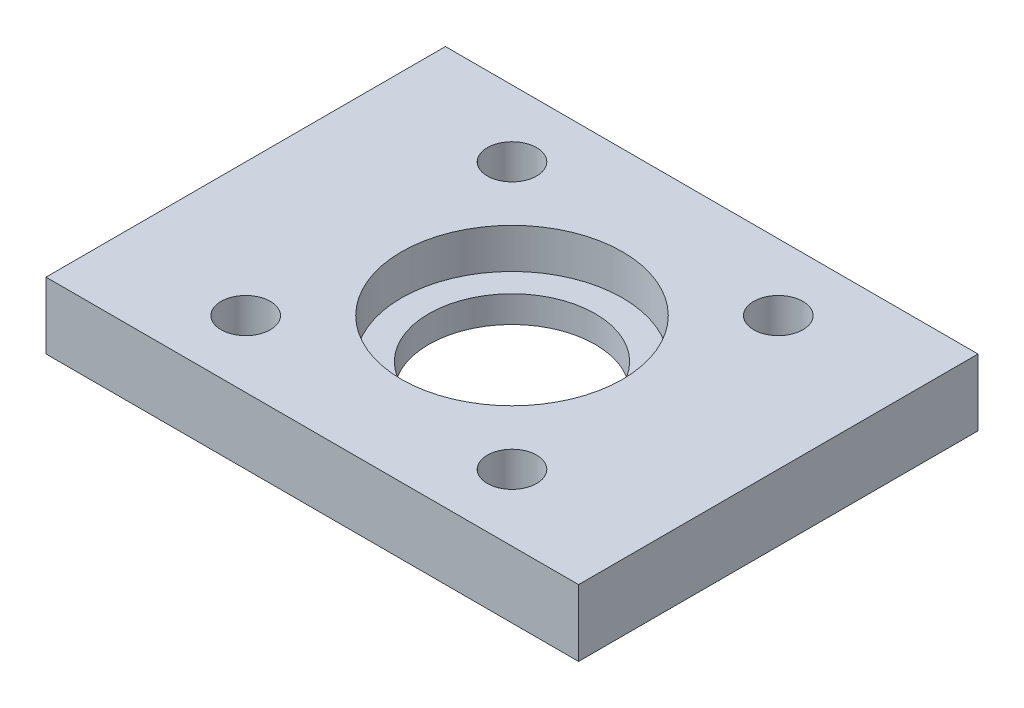
ISO-10303-21;
HEADER;
FILE_DESCRIPTION(('STEP AP214'),'2;1');
FILE_NAME('part.step','',(''),(''),'','','');
FILE_SCHEMA(('AUTOMOTIVE_DESIGN { 1 0 10303 214 1 1 1 1 }'));
ENDSEC;
DATA;
#1=APPLICATION_CONTEXT('core data for automotive mechanical design processes');
#2=APPLICATION_PROTOCOL_DEFINITION('international standard','automotive_design',2000,#1);
#3=PRODUCT_CONTEXT('',#1,'mechanical');
#4=PRODUCT('Part','Part','',(#3));
#5=PRODUCT_RELATED_PRODUCT_CATEGORY('part','',(#4));
#6=PRODUCT_DEFINITION_FORMATION('','',#4);
#7=PRODUCT_DEFINITION_CONTEXT('part definition',#1,'design');
#8=PRODUCT_DEFINITION('design','',#6,#7);
#9=PRODUCT_DEFINITION_SHAPE('','',#8);
#10=(LENGTH_UNIT() NAMED_UNIT(*) SI_UNIT(.MILLI.,.METRE.));
#11=(NAMED_UNIT(*) PLANE_ANGLE_UNIT() SI_UNIT($,.RADIAN.));
#12=(NAMED_UNIT(*) SI_UNIT($,.STERADIAN.) SOLID_ANGLE_UNIT());
#13=UNCERTAINTY_MEASURE_WITH_UNIT(LENGTH_MEASURE(1.E-05),#10,'distance_accuracy_value','');
#14=(GEOMETRIC_REPRESENTATION_CONTEXT(3) GLOBAL_UNCERTAINTY_ASSIGNED_CONTEXT((#13)) GLOBAL_UNIT_ASSIGNED_CONTEXT((#10,
#11,#12)) REPRESENTATION_CONTEXT('',''));
#15=CARTESIAN_POINT('',(0.,0.,0.));
#16=DIRECTION('',(0.,0.,1.));
#17=DIRECTION('',(1.,0.,0.));
#18=AXIS2_PLACEMENT_3D('',#15,#16,#17);
#19=CARTESIAN_POINT('',(0.,2.,0.));
#20=DIRECTION('',(0.,1.,0.));
#21=DIRECTION('',(0.,0.,1.));
#22=AXIS2_PLACEMENT_3D('',#19,#20,#21);
#23=PLANE('',#22);
#24=CARTESIAN_POINT('',(0.,2.,0.));
#25=DIRECTION('',(0.,1.,0.));
#26=DIRECTION('',(0.,0.,1.));
#27=AXIS2_PLACEMENT_3D('',#24,#25,#26);
#28=CIRCLE('',#27,6.25);
#29=CARTESIAN_POINT('',(0.,2.,6.25));
#30=VERTEX_POINT('',#29);
#31=EDGE_CURVE('E105',#30,#30,#28,.T.);
#32=ORIENTED_EDGE('',*,*,#31,.F.);
#33=EDGE_LOOP('',(#32));
#34=FACE_BOUND('',#33,.T.);
#35=CARTESIAN_POINT('',(0.,2.,0.));
#36=DIRECTION('',(0.,1.,0.));
#37=DIRECTION('',(0.,0.,1.));
#38=AXIS2_PLACEMENT_3D('',#35,#36,#37);
#39=CIRCLE('',#38,8.3);
#40=CARTESIAN_POINT('',(0.,2.,8.3));
#41=VERTEX_POINT('',#40);
#42=EDGE_CURVE('E98',#41,#41,#39,.T.);
#43=ORIENTED_EDGE('',*,*,#42,.T.);
#44=EDGE_LOOP('',(#43));
#45=FACE_BOUND('',#44,.T.);
#46=ADVANCED_FACE('F33',(#34,#45),#23,.T.);
#47=CARTESIAN_POINT('',(0.,0.,0.));
#48=DIRECTION('',(0.,1.,0.));
#49=DIRECTION('',(0.,0.,1.));
#50=AXIS2_PLACEMENT_3D('',#47,#48,#49);
#51=PLANE('',#50);
#52=DIRECTION('',(0.,0.,1.));
#53=VECTOR('',#52,1.);
#54=CARTESIAN_POINT('',(-20.,0.,15.));
#55=LINE('',#54,#53);
#56=CARTESIAN_POINT('',(-20.,0.,-15.));
#57=VERTEX_POINT('',#56);
#58=CARTESIAN_POINT('',(-20.,0.,15.));
#59=VERTEX_POINT('',#58);
#60=EDGE_CURVE('E108',#57,#59,#55,.T.);
#61=ORIENTED_EDGE('',*,*,#60,.F.);
#62=DIRECTION('',(-1.,0.,0.));
#63=VECTOR('',#62,1.);
#64=CARTESIAN_POINT('',(20.,0.,-15.));
#65=LINE('',#64,#63);
#66=CARTESIAN_POINT('',(20.,0.,-15.));
#67=VERTEX_POINT('',#66);
#68=EDGE_CURVE('E48',#67,#57,#65,.T.);
#69=ORIENTED_EDGE('',*,*,#68,.F.);
#70=DIRECTION('',(0.,0.,-1.));
#71=VECTOR('',#70,1.);
#72=CARTESIAN_POINT('',(20.,0.,15.));
#73=LINE('',#72,#71);
#74=CARTESIAN_POINT('',(20.,0.,15.));
#75=VERTEX_POINT('',#74);
#76=EDGE_CURVE('E56',#75,#67,#73,.T.);
#77=ORIENTED_EDGE('',*,*,#76,.F.);
#78=DIRECTION('',(1.,0.,0.));
#79=VECTOR('',#78,1.);
#80=CARTESIAN_POINT('',(20.,0.,15.));
#81=LINE('',#80,#79);
#82=EDGE_CURVE('E112',#59,#75,#81,.T.);
#83=ORIENTED_EDGE('',*,*,#82,.F.);
#84=EDGE_LOOP('',(#61,#69,#77,#83));
#85=FACE_BOUND('',#84,.T.);
#86=CARTESIAN_POINT('',(0.,0.,0.));
#87=DIRECTION('',(0.,1.,0.));
#88=DIRECTION('',(0.,0.,1.));
#89=AXIS2_PLACEMENT_3D('',#86,#87,#88);
#90=CIRCLE('',#89,6.25);
#91=CARTESIAN_POINT('',(0.,0.,6.25));
#92=VERTEX_POINT('',#91);
#93=EDGE_CURVE('E104',#92,#92,#90,.T.);
#94=ORIENTED_EDGE('',*,*,#93,.T.);
#95=EDGE_LOOP('',(#94));
#96=FACE_BOUND('',#95,.T.);
#97=ADVANCED_FACE('F119',(#85,#96),#51,.F.);
#98=CARTESIAN_POINT('',(-20.,2.,15.));
#99=DIRECTION('',(1.,0.,0.));
#100=DIRECTION('',(0.,0.,-1.));
#101=AXIS2_PLACEMENT_3D('',#98,#99,#100);
#102=PLANE('',#101);
#103=ORIENTED_EDGE('',*,*,#60,.T.);
#104=DIRECTION('',(0.,-1.,0.));
#105=VECTOR('',#104,1.);
#106=CARTESIAN_POINT('',(-20.,2.,15.));
#107=LINE('',#106,#105);
#108=CARTESIAN_POINT('',(-20.,5.,15.));
#109=VERTEX_POINT('',#108);
#110=EDGE_CURVE('E11',#109,#59,#107,.T.);
#111=ORIENTED_EDGE('',*,*,#110,.F.);
#112=DIRECTION('',(0.,0.,1.));
#113=VECTOR('',#112,1.);
#114=CARTESIAN_POINT('',(-20.,5.,-15.));
#115=LINE('',#114,#113);
#116=CARTESIAN_POINT('',(-20.,5.,-15.));
#117=VERTEX_POINT('',#116);
#118=EDGE_CURVE('E84',#117,#109,#115,.T.);
#119=ORIENTED_EDGE('',*,*,#118,.F.);
#120=DIRECTION('',(0.,-1.,0.));
#121=VECTOR('',#120,1.);
#122=CARTESIAN_POINT('',(-20.,2.,-15.));
#123=LINE('',#122,#121);
#124=EDGE_CURVE('E73',#117,#57,#123,.T.);
#125=ORIENTED_EDGE('',*,*,#124,.T.);
#126=EDGE_LOOP('',(#103,#111,#119,#125));
#127=FACE_BOUND('',#126,.T.);
#128=ADVANCED_FACE('F35',(#127),#102,.F.);
#129=CARTESIAN_POINT('',(20.,2.,15.));
#130=DIRECTION('',(0.,0.,-1.));
#131=DIRECTION('',(-1.,0.,0.));
#132=AXIS2_PLACEMENT_3D('',#129,#130,#131);
#133=PLANE('',#132);
#134=ORIENTED_EDGE('',*,*,#82,.T.);
#135=DIRECTION('',(0.,-1.,0.));
#136=VECTOR('',#135,1.);
#137=CARTESIAN_POINT('',(20.,2.,15.));
#138=LINE('',#137,#136);
#139=CARTESIAN_POINT('',(20.,5.,15.));
#140=VERTEX_POINT('',#139);
#141=EDGE_CURVE('E41',#140,#75,#138,.T.);
#142=ORIENTED_EDGE('',*,*,#141,.F.);
#143=DIRECTION('',(1.,0.,0.));
#144=VECTOR('',#143,1.);
#145=CARTESIAN_POINT('',(-20.,5.,15.));
#146=LINE('',#145,#144);
#147=EDGE_CURVE('E88',#109,#140,#146,.T.);
#148=ORIENTED_EDGE('',*,*,#147,.F.);
#149=ORIENTED_EDGE('',*,*,#110,.T.);
#150=EDGE_LOOP('',(#134,#142,#148,#149));
#151=FACE_BOUND('',#150,.T.);
#152=ADVANCED_FACE('F121',(#151),#133,.F.);
#153=CARTESIAN_POINT('',(20.,2.,15.));
#154=DIRECTION('',(-1.,0.,0.));
#155=DIRECTION('',(0.,0.,1.));
#156=AXIS2_PLACEMENT_3D('',#153,#154,#155);
#157=PLANE('',#156);
#158=ORIENTED_EDGE('',*,*,#76,.T.);
#159=DIRECTION('',(0.,-1.,0.));
#160=VECTOR('',#159,1.);
#161=CARTESIAN_POINT('',(20.,2.,-15.));
#162=LINE('',#161,#160);
#163=CARTESIAN_POINT('',(20.,5.,-15.));
#164=VERTEX_POINT('',#163);
#165=EDGE_CURVE('E81',#164,#67,#162,.T.);
#166=ORIENTED_EDGE('',*,*,#165,.F.);
#167=DIRECTION('',(0.,0.,-1.));
#168=VECTOR('',#167,1.);
#169=CARTESIAN_POINT('',(20.,5.,15.));
#170=LINE('',#169,#168);
#171=EDGE_CURVE('E94',#140,#164,#170,.T.);
#172=ORIENTED_EDGE('',*,*,#171,.F.);
#173=ORIENTED_EDGE('',*,*,#141,.T.);
#174=EDGE_LOOP('',(#158,#166,#172,#173));
#175=FACE_BOUND('',#174,.T.);
#176=ADVANCED_FACE('F116',(#175),#157,.F.);
#177=CARTESIAN_POINT('',(20.,2.,-15.));
#178=DIRECTION('',(0.,0.,1.));
#179=DIRECTION('',(1.,0.,0.));
#180=AXIS2_PLACEMENT_3D('',#177,#178,#179);
#181=PLANE('',#180);
#182=ORIENTED_EDGE('',*,*,#68,.T.);
#183=ORIENTED_EDGE('',*,*,#124,.F.);
#184=DIRECTION('',(-1.,0.,0.));
#185=VECTOR('',#184,1.);
#186=CARTESIAN_POINT('',(20.,5.,-15.));
#187=LINE('',#186,#185);
#188=EDGE_CURVE('E77',#164,#117,#187,.T.);
#189=ORIENTED_EDGE('',*,*,#188,.F.);
#190=ORIENTED_EDGE('',*,*,#165,.T.);
#191=EDGE_LOOP('',(#182,#183,#189,#190));
#192=FACE_BOUND('',#191,.T.);
#193=ADVANCED_FACE('F75',(#192),#181,.F.);
#194=CARTESIAN_POINT('',(0.,2.,0.));
#195=DIRECTION('',(0.,-1.,0.));
#196=DIRECTION('',(0.,0.,-1.));
#197=AXIS2_PLACEMENT_3D('',#194,#195,#196);
#198=CYLINDRICAL_SURFACE('',#197,6.25);
#199=ORIENTED_EDGE('',*,*,#31,.T.);
#200=EDGE_LOOP('',(#199));
#201=FACE_BOUND('',#200,.T.);
#202=ORIENTED_EDGE('',*,*,#93,.F.);
#203=EDGE_LOOP('',(#202));
#204=FACE_BOUND('',#203,.T.);
#205=ADVANCED_FACE('F138',(#201,#204),#198,.F.);
#206=CARTESIAN_POINT('',(0.,5.,0.));
#207=DIRECTION('',(0.,1.,0.));
#208=DIRECTION('',(0.,0.,1.));
#209=AXIS2_PLACEMENT_3D('',#206,#207,#208);
#210=PLANE('',#209);
#211=CARTESIAN_POINT('',(-10.,5.,10.));
#212=DIRECTION('',(0.,1.,0.));
#213=DIRECTION('',(0.,0.,1.));
#214=AXIS2_PLACEMENT_3D('',#211,#212,#213);
#215=CIRCLE('',#214,1.85);
#216=CARTESIAN_POINT('',(-10.,5.,11.85));
#217=VERTEX_POINT('',#216);
#218=EDGE_CURVE('E215',#217,#217,#215,.T.);
#219=ORIENTED_EDGE('',*,*,#218,.F.);
#220=EDGE_LOOP('',(#219));
#221=FACE_BOUND('',#220,.T.);
#222=CARTESIAN_POINT('',(10.,5.,10.));
#223=DIRECTION('',(0.,1.,0.));
#224=DIRECTION('',(0.,0.,1.));
#225=AXIS2_PLACEMENT_3D('',#222,#223,#224);
#226=CIRCLE('',#225,1.85);
#227=CARTESIAN_POINT('',(10.,5.,11.85));
#228=VERTEX_POINT('',#227);
#229=EDGE_CURVE('E209',#228,#228,#226,.T.);
#230=ORIENTED_EDGE('',*,*,#229,.F.);
#231=EDGE_LOOP('',(#230));
#232=FACE_BOUND('',#231,.T.);
#233=CARTESIAN_POINT('',(10.,5.,-10.));
#234=DIRECTION('',(0.,1.,0.));
#235=DIRECTION('',(0.,0.,1.));
#236=AXIS2_PLACEMENT_3D('',#233,#234,#235);
#237=CIRCLE('',#236,1.85);
#238=CARTESIAN_POINT('',(10.,5.,-8.15));
#239=VERTEX_POINT('',#238);
#240=EDGE_CURVE('E198',#239,#239,#237,.T.);
#241=ORIENTED_EDGE('',*,*,#240,.F.);
#242=EDGE_LOOP('',(#241));
#243=FACE_BOUND('',#242,.T.);
#244=CARTESIAN_POINT('',(-10.,5.,-10.));
#245=DIRECTION('',(0.,1.,0.));
#246=DIRECTION('',(0.,0.,1.));
#247=AXIS2_PLACEMENT_3D('',#244,#245,#246);
#248=CIRCLE('',#247,1.85);
#249=CARTESIAN_POINT('',(-10.,5.,-8.15));
#250=VERTEX_POINT('',#249);
#251=EDGE_CURVE('E197',#250,#250,#248,.T.);
#252=ORIENTED_EDGE('',*,*,#251,.F.);
#253=EDGE_LOOP('',(#252));
#254=FACE_BOUND('',#253,.T.);
#255=ORIENTED_EDGE('',*,*,#188,.T.);
#256=ORIENTED_EDGE('',*,*,#118,.T.);
#257=ORIENTED_EDGE('',*,*,#147,.T.);
#258=ORIENTED_EDGE('',*,*,#171,.T.);
#259=EDGE_LOOP('',(#255,#256,#257,#258));
#260=FACE_BOUND('',#259,.T.);
#261=CARTESIAN_POINT('',(0.,5.,0.));
#262=DIRECTION('',(0.,1.,0.));
#263=DIRECTION('',(0.,0.,1.));
#264=AXIS2_PLACEMENT_3D('',#261,#262,#263);
#265=CIRCLE('',#264,8.3);
#266=CARTESIAN_POINT('',(0.,5.,8.3));
#267=VERTEX_POINT('',#266);
#268=EDGE_CURVE('E95',#267,#267,#265,.T.);
#269=ORIENTED_EDGE('',*,*,#268,.F.);
#270=EDGE_LOOP('',(#269));
#271=FACE_BOUND('',#270,.T.);
#272=ADVANCED_FACE('F91',(#221,#232,#243,#254,#260,#271),#210,.T.);
#273=CARTESIAN_POINT('',(0.,5.,0.));
#274=DIRECTION('',(0.,-1.,0.));
#275=DIRECTION('',(0.,0.,-1.));
#276=AXIS2_PLACEMENT_3D('',#273,#274,#275);
#277=CYLINDRICAL_SURFACE('',#276,8.3);
#278=ORIENTED_EDGE('',*,*,#268,.T.);
#279=EDGE_LOOP('',(#278));
#280=FACE_BOUND('',#279,.T.);
#281=ORIENTED_EDGE('',*,*,#42,.F.);
#282=EDGE_LOOP('',(#281));
#283=FACE_BOUND('',#282,.T.);
#284=ADVANCED_FACE('F149',(#280,#283),#277,.F.);
#285=CARTESIAN_POINT('',(-10.,1.,-10.));
#286=DIRECTION('',(0.,1.,0.));
#287=DIRECTION('',(0.,0.,1.));
#288=AXIS2_PLACEMENT_3D('',#285,#286,#287);
#289=CYLINDRICAL_SURFACE('',#288,1.85);
#290=CARTESIAN_POINT('',(-10.,1.,-10.));
#291=DIRECTION('',(0.,1.,0.));
#292=DIRECTION('',(0.,0.,1.));
#293=AXIS2_PLACEMENT_3D('',#290,#291,#292);
#294=CIRCLE('',#293,1.85);
#295=CARTESIAN_POINT('',(-10.,1.,-8.15));
#296=VERTEX_POINT('',#295);
#297=EDGE_CURVE('E201',#296,#296,#294,.T.);
#298=ORIENTED_EDGE('',*,*,#297,.F.);
#299=EDGE_LOOP('',(#298));
#300=FACE_BOUND('',#299,.T.);
#301=ORIENTED_EDGE('',*,*,#251,.T.);
#302=EDGE_LOOP('',(#301));
#303=FACE_BOUND('',#302,.T.);
#304=ADVANCED_FACE('F156',(#300,#303),#289,.F.);
#305=CARTESIAN_POINT('',(-10.,1.,-10.));
#306=DIRECTION('',(0.,1.,0.));
#307=DIRECTION('',(0.,0.,1.));
#308=AXIS2_PLACEMENT_3D('',#305,#306,#307);
#309=PLANE('',#308);
#310=ORIENTED_EDGE('',*,*,#297,.T.);
#311=EDGE_LOOP('',(#310));
#312=FACE_BOUND('',#311,.T.);
#313=ADVANCED_FACE('F164',(#312),#309,.T.);
#314=CARTESIAN_POINT('',(10.,1.,-10.));
#315=DIRECTION('',(0.,1.,0.));
#316=DIRECTION('',(0.,0.,1.));
#317=AXIS2_PLACEMENT_3D('',#314,#315,#316);
#318=CYLINDRICAL_SURFACE('',#317,1.85);
#319=CARTESIAN_POINT('',(10.,1.,-10.));
#320=DIRECTION('',(0.,1.,0.));
#321=DIRECTION('',(0.,0.,1.));
#322=AXIS2_PLACEMENT_3D('',#319,#320,#321);
#323=CIRCLE('',#322,1.85);
#324=CARTESIAN_POINT('',(10.,1.,-8.15));
#325=VERTEX_POINT('',#324);
#326=EDGE_CURVE('E196',#325,#325,#323,.T.);
#327=ORIENTED_EDGE('',*,*,#326,.F.);
#328=EDGE_LOOP('',(#327));
#329=FACE_BOUND('',#328,.T.);
#330=ORIENTED_EDGE('',*,*,#240,.T.);
#331=EDGE_LOOP('',(#330));
#332=FACE_BOUND('',#331,.T.);
#333=ADVANCED_FACE('F168',(#329,#332),#318,.F.);
#334=CARTESIAN_POINT('',(10.,1.,-10.));
#335=DIRECTION('',(0.,1.,0.));
#336=DIRECTION('',(0.,0.,1.));
#337=AXIS2_PLACEMENT_3D('',#334,#335,#336);
#338=PLANE('',#337);
#339=ORIENTED_EDGE('',*,*,#326,.T.);
#340=EDGE_LOOP('',(#339));
#341=FACE_BOUND('',#340,.T.);
#342=ADVANCED_FACE('F182',(#341),#338,.T.);
#343=CARTESIAN_POINT('',(10.,1.,10.));
#344=DIRECTION('',(0.,1.,0.));
#345=DIRECTION('',(0.,0.,1.));
#346=AXIS2_PLACEMENT_3D('',#343,#344,#345);
#347=CYLINDRICAL_SURFACE('',#346,1.85);
#348=CARTESIAN_POINT('',(10.,1.,10.));
#349=DIRECTION('',(0.,1.,0.));
#350=DIRECTION('',(0.,0.,1.));
#351=AXIS2_PLACEMENT_3D('',#348,#349,#350);
#352=CIRCLE('',#351,1.85);
#353=CARTESIAN_POINT('',(10.,1.,11.85));
#354=VERTEX_POINT('',#353);
#355=EDGE_CURVE('E204',#354,#354,#352,.T.);
#356=ORIENTED_EDGE('',*,*,#355,.F.);
#357=EDGE_LOOP('',(#356));
#358=FACE_BOUND('',#357,.T.);
#359=ORIENTED_EDGE('',*,*,#229,.T.);
#360=EDGE_LOOP('',(#359));
#361=FACE_BOUND('',#360,.T.);
#362=ADVANCED_FACE('F179',(#358,#361),#347,.F.);
#363=CARTESIAN_POINT('',(10.,1.,10.));
#364=DIRECTION('',(0.,1.,0.));
#365=DIRECTION('',(0.,0.,1.));
#366=AXIS2_PLACEMENT_3D('',#363,#364,#365);
#367=PLANE('',#366);
#368=ORIENTED_EDGE('',*,*,#355,.T.);
#369=EDGE_LOOP('',(#368));
#370=FACE_BOUND('',#369,.T.);
#371=ADVANCED_FACE('F174',(#370),#367,.T.);
#372=CARTESIAN_POINT('',(-10.,1.,10.));
#373=DIRECTION('',(0.,1.,0.));
#374=DIRECTION('',(0.,0.,1.));
#375=AXIS2_PLACEMENT_3D('',#372,#373,#374);
#376=CYLINDRICAL_SURFACE('',#375,1.85);
#377=CARTESIAN_POINT('',(-10.,1.,10.));
#378=DIRECTION('',(0.,1.,0.));
#379=DIRECTION('',(0.,0.,1.));
#380=AXIS2_PLACEMENT_3D('',#377,#378,#379);
#381=CIRCLE('',#380,1.85);
#382=CARTESIAN_POINT('',(-10.,1.,11.85));
#383=VERTEX_POINT('',#382);
#384=EDGE_CURVE('E212',#383,#383,#381,.T.);
#385=ORIENTED_EDGE('',*,*,#384,.F.);
#386=EDGE_LOOP('',(#385));
#387=FACE_BOUND('',#386,.T.);
#388=ORIENTED_EDGE('',*,*,#218,.T.);
#389=EDGE_LOOP('',(#388));
#390=FACE_BOUND('',#389,.T.);
#391=ADVANCED_FACE('F170',(#387,#390),#376,.F.);
#392=CARTESIAN_POINT('',(-10.,1.,10.));
#393=DIRECTION('',(0.,1.,0.));
#394=DIRECTION('',(0.,0.,1.));
#395=AXIS2_PLACEMENT_3D('',#392,#393,#394);
#396=PLANE('',#395);
#397=ORIENTED_EDGE('',*,*,#384,.T.);
#398=EDGE_LOOP('',(#397));
#399=FACE_BOUND('',#398,.T.);
#400=ADVANCED_FACE('F173',(#399),#396,.T.);
#401=CLOSED_SHELL('',(#46,#97,#128,#152,#176,#193,#205,#272,#284,#304,#313,#333,#342,#362,#371,
#391,#400));
#402=MANIFOLD_SOLID_BREP('B2',#401);
#403=ADVANCED_BREP_SHAPE_REPRESENTATION('',(#18,#402),#14);
#404=SHAPE_DEFINITION_REPRESENTATION(#9,#403);
ENDSEC;
END-ISO-10303-21;
